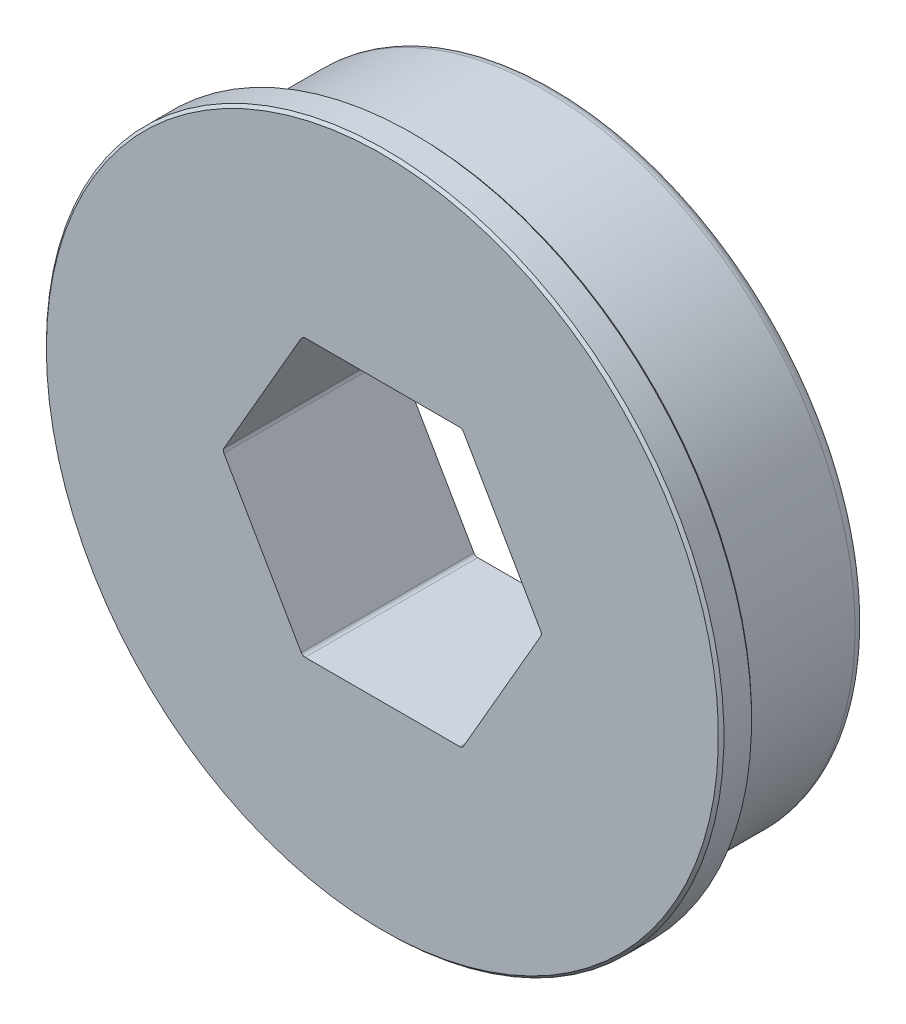
ISO-10303-21;
HEADER;
FILE_DESCRIPTION(('STEP AP214'),'2;1');
FILE_NAME('part.step','',(''),(''),'','','');
FILE_SCHEMA(('AUTOMOTIVE_DESIGN { 1 0 10303 214 1 1 1 1 }'));
ENDSEC;
DATA;
#1=APPLICATION_CONTEXT('core data for automotive mechanical design processes');
#2=APPLICATION_PROTOCOL_DEFINITION('international standard','automotive_design',2000,#1);
#3=PRODUCT_CONTEXT('',#1,'mechanical');
#4=PRODUCT('Part','Part','',(#3));
#5=PRODUCT_RELATED_PRODUCT_CATEGORY('part','',(#4));
#6=PRODUCT_DEFINITION_FORMATION('','',#4);
#7=PRODUCT_DEFINITION_CONTEXT('part definition',#1,'design');
#8=PRODUCT_DEFINITION('design','',#6,#7);
#9=PRODUCT_DEFINITION_SHAPE('','',#8);
#10=(LENGTH_UNIT() NAMED_UNIT(*) SI_UNIT(.MILLI.,.METRE.));
#11=(NAMED_UNIT(*) PLANE_ANGLE_UNIT() SI_UNIT($,.RADIAN.));
#12=(NAMED_UNIT(*) SI_UNIT($,.STERADIAN.) SOLID_ANGLE_UNIT());
#13=UNCERTAINTY_MEASURE_WITH_UNIT(LENGTH_MEASURE(1.E-05),#10,'distance_accuracy_value','');
#14=(GEOMETRIC_REPRESENTATION_CONTEXT(3) GLOBAL_UNCERTAINTY_ASSIGNED_CONTEXT((#13)) GLOBAL_UNIT_ASSIGNED_CONTEXT((#10,
#11,#12)) REPRESENTATION_CONTEXT('',''));
#15=CARTESIAN_POINT('',(0.,0.,0.));
#16=DIRECTION('',(0.,0.,1.));
#17=DIRECTION('',(1.,0.,0.));
#18=AXIS2_PLACEMENT_3D('',#15,#16,#17);
#19=CARTESIAN_POINT('',(0.,0.,7.80034));
#20=DIRECTION('',(0.,0.,-1.));
#21=DIRECTION('',(-1.,0.,0.));
#22=AXIS2_PLACEMENT_3D('',#19,#20,#21);
#23=CONICAL_SURFACE('',#22,15.5575,0.785398163397442);
#24=CARTESIAN_POINT('',(0.,0.,7.92734));
#25=DIRECTION('',(0.,0.,-1.));
#26=DIRECTION('',(-1.,0.,0.));
#27=AXIS2_PLACEMENT_3D('',#24,#25,#26);
#28=CIRCLE('',#27,15.4305);
#29=CARTESIAN_POINT('',(-15.4305,0.,7.92734));
#30=VERTEX_POINT('',#29);
#31=EDGE_CURVE('E181',#30,#30,#28,.T.);
#32=ORIENTED_EDGE('',*,*,#31,.T.);
#33=EDGE_LOOP('',(#32));
#34=FACE_BOUND('',#33,.T.);
#35=CARTESIAN_POINT('',(0.,0.,7.80034));
#36=DIRECTION('',(0.,0.,-1.));
#37=DIRECTION('',(-1.,0.,0.));
#38=AXIS2_PLACEMENT_3D('',#35,#36,#37);
#39=CIRCLE('',#38,15.5575);
#40=CARTESIAN_POINT('',(-15.5575,0.,7.80034));
#41=VERTEX_POINT('',#40);
#42=EDGE_CURVE('E168',#41,#41,#39,.T.);
#43=ORIENTED_EDGE('',*,*,#42,.F.);
#44=EDGE_LOOP('',(#43));
#45=FACE_BOUND('',#44,.T.);
#46=ADVANCED_FACE('F34',(#34,#45),#23,.T.);
#47=CARTESIAN_POINT('',(15.4305,0.,7.92734));
#48=DIRECTION('',(0.,0.,1.));
#49=DIRECTION('',(1.,0.,0.));
#50=AXIS2_PLACEMENT_3D('',#47,#48,#49);
#51=PLANE('',#50);
#52=DIRECTION('',(1.,0.,0.));
#53=VECTOR('',#52,1.);
#54=CARTESIAN_POINT('',(-3.66617420935412,-6.35,7.92734));
#55=LINE('',#54,#53);
#56=CARTESIAN_POINT('',(-3.54885663465478,-6.35,7.92734));
#57=VERTEX_POINT('',#56);
#58=CARTESIAN_POINT('',(3.5488566346548,-6.35000000000001,7.92734));
#59=VERTEX_POINT('',#58);
#60=EDGE_CURVE('E159',#57,#59,#55,.T.);
#61=ORIENTED_EDGE('',*,*,#60,.F.);
#62=CARTESIAN_POINT('',(-3.54885663465478,-6.1468,7.92734));
#63=DIRECTION('',(0.,0.,1.));
#64=DIRECTION('',(1.,0.,0.));
#65=AXIS2_PLACEMENT_3D('',#62,#63,#64);
#66=CIRCLE('',#65,0.2032);
#67=CARTESIAN_POINT('',(-3.72483299670378,-6.24840000000001,7.92734));
#68=VERTEX_POINT('',#67);
#69=EDGE_CURVE('E217',#57,#68,#66,.F.);
#70=ORIENTED_EDGE('',*,*,#69,.T.);
#71=DIRECTION('',(0.5,-0.866025403784439,0.));
#72=VECTOR('',#71,1.);
#73=CARTESIAN_POINT('',(-7.33234841870824,0.,7.92734));
#74=LINE('',#73,#72);
#75=CARTESIAN_POINT('',(-7.27368963135857,-0.101600000000002,7.92734));
#76=VERTEX_POINT('',#75);
#77=EDGE_CURVE('E164',#76,#68,#74,.T.);
#78=ORIENTED_EDGE('',*,*,#77,.F.);
#79=CARTESIAN_POINT('',(-7.09771326930958,0.,7.92734));
#80=DIRECTION('',(0.,0.,1.));
#81=DIRECTION('',(1.,0.,0.));
#82=AXIS2_PLACEMENT_3D('',#79,#80,#81);
#83=CIRCLE('',#82,0.2032);
#84=CARTESIAN_POINT('',(-7.27368963135857,0.101599999999999,7.92734));
#85=VERTEX_POINT('',#84);
#86=EDGE_CURVE('E225',#76,#85,#83,.F.);
#87=ORIENTED_EDGE('',*,*,#86,.T.);
#88=DIRECTION('',(-0.5,-0.866025403784439,0.));
#89=VECTOR('',#88,1.);
#90=CARTESIAN_POINT('',(-3.66617420935412,6.34999999999999,7.92734));
#91=LINE('',#90,#89);
#92=CARTESIAN_POINT('',(-3.72483299670379,6.24839999999999,7.92734));
#93=VERTEX_POINT('',#92);
#94=EDGE_CURVE('E157',#93,#85,#91,.T.);
#95=ORIENTED_EDGE('',*,*,#94,.F.);
#96=CARTESIAN_POINT('',(-3.54885663465479,6.14679999999999,7.92734));
#97=DIRECTION('',(0.,0.,1.));
#98=DIRECTION('',(1.,0.,0.));
#99=AXIS2_PLACEMENT_3D('',#96,#97,#98);
#100=CIRCLE('',#99,0.2032);
#101=CARTESIAN_POINT('',(-3.54885663465479,6.34999999999999,7.92734));
#102=VERTEX_POINT('',#101);
#103=EDGE_CURVE('E229',#93,#102,#100,.F.);
#104=ORIENTED_EDGE('',*,*,#103,.T.);
#105=DIRECTION('',(-1.,0.,0.));
#106=VECTOR('',#105,1.);
#107=CARTESIAN_POINT('',(3.66617420935413,6.35,7.92734));
#108=LINE('',#107,#106);
#109=CARTESIAN_POINT('',(3.5488566346548,6.35,7.92734));
#110=VERTEX_POINT('',#109);
#111=EDGE_CURVE('E153',#110,#102,#108,.T.);
#112=ORIENTED_EDGE('',*,*,#111,.F.);
#113=CARTESIAN_POINT('',(3.5488566346548,6.14679999999999,7.92734));
#114=DIRECTION('',(0.,0.,1.));
#115=DIRECTION('',(1.,0.,0.));
#116=AXIS2_PLACEMENT_3D('',#113,#114,#115);
#117=CIRCLE('',#116,0.2032);
#118=CARTESIAN_POINT('',(3.7248329967038,6.24839999999999,7.92734));
#119=VERTEX_POINT('',#118);
#120=EDGE_CURVE('E152',#110,#119,#117,.F.);
#121=ORIENTED_EDGE('',*,*,#120,.T.);
#122=DIRECTION('',(-0.5,0.866025403784438,0.));
#123=VECTOR('',#122,1.);
#124=CARTESIAN_POINT('',(7.33234841870826,0.,7.92734));
#125=LINE('',#124,#123);
#126=CARTESIAN_POINT('',(7.27368963135859,0.101599999999995,7.92734));
#127=VERTEX_POINT('',#126);
#128=EDGE_CURVE('E141',#127,#119,#125,.T.);
#129=ORIENTED_EDGE('',*,*,#128,.F.);
#130=CARTESIAN_POINT('',(7.09771326930959,0.,7.92734));
#131=DIRECTION('',(0.,0.,1.));
#132=DIRECTION('',(1.,0.,0.));
#133=AXIS2_PLACEMENT_3D('',#130,#131,#132);
#134=CIRCLE('',#133,0.2032);
#135=CARTESIAN_POINT('',(7.27368963135859,-0.101600000000005,7.92734));
#136=VERTEX_POINT('',#135);
#137=EDGE_CURVE('E125',#127,#136,#134,.F.);
#138=ORIENTED_EDGE('',*,*,#137,.T.);
#139=DIRECTION('',(0.5,0.866025403784439,0.));
#140=VECTOR('',#139,1.);
#141=CARTESIAN_POINT('',(3.66617420935413,-6.35000000000001,7.92734));
#142=LINE('',#141,#140);
#143=CARTESIAN_POINT('',(3.7248329967038,-6.24840000000001,7.92734));
#144=VERTEX_POINT('',#143);
#145=EDGE_CURVE('E154',#144,#136,#142,.T.);
#146=ORIENTED_EDGE('',*,*,#145,.F.);
#147=CARTESIAN_POINT('',(3.5488566346548,-6.14680000000001,7.92734));
#148=DIRECTION('',(0.,0.,1.));
#149=DIRECTION('',(1.,0.,0.));
#150=AXIS2_PLACEMENT_3D('',#147,#148,#149);
#151=CIRCLE('',#150,0.2032);
#152=EDGE_CURVE('E221',#144,#59,#151,.F.);
#153=ORIENTED_EDGE('',*,*,#152,.T.);
#154=EDGE_LOOP('',(#61,#70,#78,#87,#95,#104,#112,#121,#129,#138,#146,#153));
#155=FACE_BOUND('',#154,.T.);
#156=ORIENTED_EDGE('',*,*,#31,.F.);
#157=EDGE_LOOP('',(#156));
#158=FACE_BOUND('',#157,.T.);
#159=ADVANCED_FACE('F149',(#155,#158),#51,.T.);
#160=CARTESIAN_POINT('',(0.,0.,0.));
#161=DIRECTION('',(0.,0.,-1.));
#162=DIRECTION('',(-1.,0.,0.));
#163=AXIS2_PLACEMENT_3D('',#160,#161,#162);
#164=PLANE('',#163);
#165=CARTESIAN_POINT('',(0.,0.,0.));
#166=DIRECTION('',(0.,0.,-1.));
#167=DIRECTION('',(-1.,0.,0.));
#168=AXIS2_PLACEMENT_3D('',#165,#166,#167);
#169=CIRCLE('',#168,13.7795);
#170=CARTESIAN_POINT('',(-13.7795,0.,0.));
#171=VERTEX_POINT('',#170);
#172=EDGE_CURVE('E42',#171,#171,#169,.T.);
#173=ORIENTED_EDGE('',*,*,#172,.T.);
#174=EDGE_LOOP('',(#173));
#175=FACE_BOUND('',#174,.T.);
#176=DIRECTION('',(0.5,-0.866025403784439,0.));
#177=VECTOR('',#176,1.);
#178=CARTESIAN_POINT('',(-7.33234841870824,0.,0.));
#179=LINE('',#178,#177);
#180=CARTESIAN_POINT('',(-7.27368963135857,-0.101600000000002,0.));
#181=VERTEX_POINT('',#180);
#182=CARTESIAN_POINT('',(-3.72483299670378,-6.24840000000001,0.));
#183=VERTEX_POINT('',#182);
#184=EDGE_CURVE('E172',#181,#183,#179,.T.);
#185=ORIENTED_EDGE('',*,*,#184,.T.);
#186=CARTESIAN_POINT('',(-3.54885663465478,-6.1468,0.));
#187=DIRECTION('',(0.,0.,-1.));
#188=DIRECTION('',(-1.,0.,0.));
#189=AXIS2_PLACEMENT_3D('',#186,#187,#188);
#190=CIRCLE('',#189,0.2032);
#191=CARTESIAN_POINT('',(-3.54885663465478,-6.35,0.));
#192=VERTEX_POINT('',#191);
#193=EDGE_CURVE('E219',#183,#192,#190,.F.);
#194=ORIENTED_EDGE('',*,*,#193,.T.);
#195=DIRECTION('',(1.,0.,0.));
#196=VECTOR('',#195,1.);
#197=CARTESIAN_POINT('',(-3.66617420935412,-6.35,0.));
#198=LINE('',#197,#196);
#199=CARTESIAN_POINT('',(3.5488566346548,-6.35000000000001,0.));
#200=VERTEX_POINT('',#199);
#201=EDGE_CURVE('E167',#192,#200,#198,.T.);
#202=ORIENTED_EDGE('',*,*,#201,.T.);
#203=CARTESIAN_POINT('',(3.5488566346548,-6.14680000000001,0.));
#204=DIRECTION('',(0.,0.,-1.));
#205=DIRECTION('',(-1.,0.,0.));
#206=AXIS2_PLACEMENT_3D('',#203,#204,#205);
#207=CIRCLE('',#206,0.2032);
#208=CARTESIAN_POINT('',(3.7248329967038,-6.24840000000001,0.));
#209=VERTEX_POINT('',#208);
#210=EDGE_CURVE('E223',#200,#209,#207,.F.);
#211=ORIENTED_EDGE('',*,*,#210,.T.);
#212=DIRECTION('',(0.5,0.866025403784439,0.));
#213=VECTOR('',#212,1.);
#214=CARTESIAN_POINT('',(3.66617420935413,-6.35000000000001,0.));
#215=LINE('',#214,#213);
#216=CARTESIAN_POINT('',(7.27368963135859,-0.101600000000005,0.));
#217=VERTEX_POINT('',#216);
#218=EDGE_CURVE('E303',#209,#217,#215,.T.);
#219=ORIENTED_EDGE('',*,*,#218,.T.);
#220=CARTESIAN_POINT('',(7.09771326930959,0.,0.));
#221=DIRECTION('',(0.,0.,-1.));
#222=DIRECTION('',(-1.,0.,0.));
#223=AXIS2_PLACEMENT_3D('',#220,#221,#222);
#224=CIRCLE('',#223,0.2032);
#225=CARTESIAN_POINT('',(7.27368963135859,0.101599999999995,0.));
#226=VERTEX_POINT('',#225);
#227=EDGE_CURVE('E135',#217,#226,#224,.F.);
#228=ORIENTED_EDGE('',*,*,#227,.T.);
#229=DIRECTION('',(-0.5,0.866025403784438,0.));
#230=VECTOR('',#229,1.);
#231=CARTESIAN_POINT('',(7.33234841870826,0.,0.));
#232=LINE('',#231,#230);
#233=CARTESIAN_POINT('',(3.7248329967038,6.24839999999999,0.));
#234=VERTEX_POINT('',#233);
#235=EDGE_CURVE('E144',#226,#234,#232,.T.);
#236=ORIENTED_EDGE('',*,*,#235,.T.);
#237=CARTESIAN_POINT('',(3.5488566346548,6.14679999999999,0.));
#238=DIRECTION('',(0.,0.,-1.));
#239=DIRECTION('',(-1.,0.,0.));
#240=AXIS2_PLACEMENT_3D('',#237,#238,#239);
#241=CIRCLE('',#240,0.2032);
#242=CARTESIAN_POINT('',(3.5488566346548,6.35,0.));
#243=VERTEX_POINT('',#242);
#244=EDGE_CURVE('E215',#234,#243,#241,.F.);
#245=ORIENTED_EDGE('',*,*,#244,.T.);
#246=DIRECTION('',(-1.,0.,0.));
#247=VECTOR('',#246,1.);
#248=CARTESIAN_POINT('',(3.66617420935413,6.35,0.));
#249=LINE('',#248,#247);
#250=CARTESIAN_POINT('',(-3.54885663465479,6.34999999999999,0.));
#251=VERTEX_POINT('',#250);
#252=EDGE_CURVE('E289',#243,#251,#249,.T.);
#253=ORIENTED_EDGE('',*,*,#252,.T.);
#254=CARTESIAN_POINT('',(-3.54885663465479,6.14679999999999,0.));
#255=DIRECTION('',(0.,0.,-1.));
#256=DIRECTION('',(-1.,0.,0.));
#257=AXIS2_PLACEMENT_3D('',#254,#255,#256);
#258=CIRCLE('',#257,0.2032);
#259=CARTESIAN_POINT('',(-3.72483299670379,6.24839999999999,0.));
#260=VERTEX_POINT('',#259);
#261=EDGE_CURVE('E56',#251,#260,#258,.F.);
#262=ORIENTED_EDGE('',*,*,#261,.T.);
#263=DIRECTION('',(-0.5,-0.866025403784439,0.));
#264=VECTOR('',#263,1.);
#265=CARTESIAN_POINT('',(-3.66617420935412,6.34999999999999,0.));
#266=LINE('',#265,#264);
#267=CARTESIAN_POINT('',(-7.27368963135857,0.101599999999999,0.));
#268=VERTEX_POINT('',#267);
#269=EDGE_CURVE('E283',#260,#268,#266,.T.);
#270=ORIENTED_EDGE('',*,*,#269,.T.);
#271=CARTESIAN_POINT('',(-7.09771326930958,0.,0.));
#272=DIRECTION('',(0.,0.,-1.));
#273=DIRECTION('',(-1.,0.,0.));
#274=AXIS2_PLACEMENT_3D('',#271,#272,#273);
#275=CIRCLE('',#274,0.2032);
#276=EDGE_CURVE('E227',#268,#181,#275,.F.);
#277=ORIENTED_EDGE('',*,*,#276,.T.);
#278=EDGE_LOOP('',(#185,#194,#202,#211,#219,#228,#236,#245,#253,#262,#270,#277));
#279=FACE_BOUND('',#278,.T.);
#280=ADVANCED_FACE('F234',(#175,#279),#164,.T.);
#281=CARTESIAN_POINT('',(0.,0.,7.92734));
#282=DIRECTION('',(0.,0.,-1.));
#283=DIRECTION('',(-1.,0.,0.));
#284=AXIS2_PLACEMENT_3D('',#281,#282,#283);
#285=CYLINDRICAL_SURFACE('',#284,14.2875);
#286=CARTESIAN_POINT('',(0.,0.,0.508));
#287=DIRECTION('',(0.,0.,-1.));
#288=DIRECTION('',(-1.,0.,0.));
#289=AXIS2_PLACEMENT_3D('',#286,#287,#288);
#290=CIRCLE('',#289,14.2875);
#291=CARTESIAN_POINT('',(-14.2875,0.,0.508));
#292=VERTEX_POINT('',#291);
#293=EDGE_CURVE('E11',#292,#292,#290,.F.);
#294=ORIENTED_EDGE('',*,*,#293,.T.);
#295=EDGE_LOOP('',(#294));
#296=FACE_BOUND('',#295,.T.);
#297=CARTESIAN_POINT('',(0.,0.,5.89534));
#298=DIRECTION('',(0.,0.,-1.));
#299=DIRECTION('',(-1.,0.,0.));
#300=AXIS2_PLACEMENT_3D('',#297,#298,#299);
#301=CIRCLE('',#300,14.2875);
#302=CARTESIAN_POINT('',(-14.2875,0.,5.89534));
#303=VERTEX_POINT('',#302);
#304=EDGE_CURVE('E178',#303,#303,#301,.T.);
#305=ORIENTED_EDGE('',*,*,#304,.T.);
#306=EDGE_LOOP('',(#305));
#307=FACE_BOUND('',#306,.T.);
#308=ADVANCED_FACE('F346',(#296,#307),#285,.T.);
#309=CARTESIAN_POINT('',(14.2875,0.,5.89534));
#310=DIRECTION('',(0.,0.,1.));
#311=DIRECTION('',(1.,0.,0.));
#312=AXIS2_PLACEMENT_3D('',#309,#310,#311);
#313=PLANE('',#312);
#314=CARTESIAN_POINT('',(0.,0.,5.89534));
#315=DIRECTION('',(0.,0.,-1.));
#316=DIRECTION('',(-1.,0.,0.));
#317=AXIS2_PLACEMENT_3D('',#314,#315,#316);
#318=CIRCLE('',#317,13.97);
#319=CARTESIAN_POINT('',(-13.97,0.,5.89534));
#320=VERTEX_POINT('',#319);
#321=EDGE_CURVE('E175',#320,#320,#318,.T.);
#322=ORIENTED_EDGE('',*,*,#321,.T.);
#323=EDGE_LOOP('',(#322));
#324=FACE_BOUND('',#323,.T.);
#325=ORIENTED_EDGE('',*,*,#304,.F.);
#326=EDGE_LOOP('',(#325));
#327=FACE_BOUND('',#326,.T.);
#328=ADVANCED_FACE('F342',(#324,#327),#313,.T.);
#329=CARTESIAN_POINT('',(0.,0.,7.92734));
#330=DIRECTION('',(0.,0.,-1.));
#331=DIRECTION('',(-1.,0.,0.));
#332=AXIS2_PLACEMENT_3D('',#329,#330,#331);
#333=CYLINDRICAL_SURFACE('',#332,13.97);
#334=CARTESIAN_POINT('',(0.,0.,6.40333999999999));
#335=DIRECTION('',(0.,0.,-1.));
#336=DIRECTION('',(-1.,0.,0.));
#337=AXIS2_PLACEMENT_3D('',#334,#335,#336);
#338=CIRCLE('',#337,13.97);
#339=CARTESIAN_POINT('',(-13.97,0.,6.40333999999999));
#340=VERTEX_POINT('',#339);
#341=EDGE_CURVE('E171',#340,#340,#338,.T.);
#342=ORIENTED_EDGE('',*,*,#341,.T.);
#343=EDGE_LOOP('',(#342));
#344=FACE_BOUND('',#343,.T.);
#345=ORIENTED_EDGE('',*,*,#321,.F.);
#346=EDGE_LOOP('',(#345));
#347=FACE_BOUND('',#346,.T.);
#348=ADVANCED_FACE('F338',(#344,#347),#333,.T.);
#349=CARTESIAN_POINT('',(13.97,0.,6.40334));
#350=DIRECTION('',(0.,0.,-1.));
#351=DIRECTION('',(-1.,0.,0.));
#352=AXIS2_PLACEMENT_3D('',#349,#350,#351);
#353=PLANE('',#352);
#354=CARTESIAN_POINT('',(0.,0.,6.40334));
#355=DIRECTION('',(0.,0.,-1.));
#356=DIRECTION('',(-1.,0.,0.));
#357=AXIS2_PLACEMENT_3D('',#354,#355,#356);
#358=CIRCLE('',#357,15.4304999999999);
#359=CARTESIAN_POINT('',(-15.4304999999999,0.,6.40334));
#360=VERTEX_POINT('',#359);
#361=EDGE_CURVE('E184',#360,#360,#358,.T.);
#362=ORIENTED_EDGE('',*,*,#361,.T.);
#363=EDGE_LOOP('',(#362));
#364=FACE_BOUND('',#363,.T.);
#365=ORIENTED_EDGE('',*,*,#341,.F.);
#366=EDGE_LOOP('',(#365));
#367=FACE_BOUND('',#366,.T.);
#368=ADVANCED_FACE('F334',(#364,#367),#353,.T.);
#369=CARTESIAN_POINT('',(0.,0.,7.92734));
#370=DIRECTION('',(0.,0.,-1.));
#371=DIRECTION('',(-1.,0.,0.));
#372=AXIS2_PLACEMENT_3D('',#369,#370,#371);
#373=CYLINDRICAL_SURFACE('',#372,15.5575);
#374=CARTESIAN_POINT('',(0.,0.,6.53034000000008));
#375=DIRECTION('',(0.,0.,-1.));
#376=DIRECTION('',(-1.,0.,0.));
#377=AXIS2_PLACEMENT_3D('',#374,#375,#376);
#378=CIRCLE('',#377,15.5575);
#379=CARTESIAN_POINT('',(-15.5575,0.,6.53034000000008));
#380=VERTEX_POINT('',#379);
#381=EDGE_CURVE('E187',#380,#380,#378,.F.);
#382=ORIENTED_EDGE('',*,*,#381,.T.);
#383=EDGE_LOOP('',(#382));
#384=FACE_BOUND('',#383,.T.);
#385=ORIENTED_EDGE('',*,*,#42,.T.);
#386=EDGE_LOOP('',(#385));
#387=FACE_BOUND('',#386,.T.);
#388=ADVANCED_FACE('F331',(#384,#387),#373,.T.);
#389=CARTESIAN_POINT('',(-3.66617420935412,-6.35,0.));
#390=DIRECTION('',(0.,-1.,0.));
#391=DIRECTION('',(1.,0.,0.));
#392=AXIS2_PLACEMENT_3D('',#389,#390,#391);
#393=PLANE('',#392);
#394=ORIENTED_EDGE('',*,*,#201,.F.);
#395=DIRECTION('',(0.,0.,1.));
#396=VECTOR('',#395,1.);
#397=CARTESIAN_POINT('',(-3.54885663465478,-6.35,7.92734));
#398=LINE('',#397,#396);
#399=EDGE_CURVE('E201',#192,#57,#398,.T.);
#400=ORIENTED_EDGE('',*,*,#399,.T.);
#401=ORIENTED_EDGE('',*,*,#60,.T.);
#402=DIRECTION('',(0.,0.,1.));
#403=VECTOR('',#402,1.);
#404=CARTESIAN_POINT('',(3.5488566346548,-6.35000000000001,0.));
#405=LINE('',#404,#403);
#406=EDGE_CURVE('E199',#59,#200,#405,.F.);
#407=ORIENTED_EDGE('',*,*,#406,.T.);
#408=EDGE_LOOP('',(#394,#400,#401,#407));
#409=FACE_BOUND('',#408,.T.);
#410=ADVANCED_FACE('F296',(#409),#393,.F.);
#411=CARTESIAN_POINT('',(-7.33234841870824,0.,0.));
#412=DIRECTION('',(-0.866025403784439,-0.5,0.));
#413=DIRECTION('',(0.5,-0.866025403784439,0.));
#414=AXIS2_PLACEMENT_3D('',#411,#412,#413);
#415=PLANE('',#414);
#416=ORIENTED_EDGE('',*,*,#77,.T.);
#417=DIRECTION('',(0.,0.,1.));
#418=VECTOR('',#417,1.);
#419=CARTESIAN_POINT('',(-3.72483299670378,-6.2484,0.));
#420=LINE('',#419,#418);
#421=EDGE_CURVE('E207',#68,#183,#420,.F.);
#422=ORIENTED_EDGE('',*,*,#421,.T.);
#423=ORIENTED_EDGE('',*,*,#184,.F.);
#424=DIRECTION('',(0.,0.,1.));
#425=VECTOR('',#424,1.);
#426=CARTESIAN_POINT('',(-7.27368963135857,-0.101600000000002,7.92734));
#427=LINE('',#426,#425);
#428=EDGE_CURVE('E204',#181,#76,#427,.T.);
#429=ORIENTED_EDGE('',*,*,#428,.T.);
#430=EDGE_LOOP('',(#416,#422,#423,#429));
#431=FACE_BOUND('',#430,.T.);
#432=ADVANCED_FACE('F285',(#431),#415,.F.);
#433=CARTESIAN_POINT('',(-3.66617420935412,6.34999999999999,0.));
#434=DIRECTION('',(-0.866025403784439,0.5,0.));
#435=DIRECTION('',(-0.5,-0.866025403784439,0.));
#436=AXIS2_PLACEMENT_3D('',#433,#434,#435);
#437=PLANE('',#436);
#438=ORIENTED_EDGE('',*,*,#94,.T.);
#439=DIRECTION('',(0.,0.,1.));
#440=VECTOR('',#439,1.);
#441=CARTESIAN_POINT('',(-7.27368963135857,0.101599999999998,0.));
#442=LINE('',#441,#440);
#443=EDGE_CURVE('E49',#85,#268,#442,.F.);
#444=ORIENTED_EDGE('',*,*,#443,.T.);
#445=ORIENTED_EDGE('',*,*,#269,.F.);
#446=DIRECTION('',(0.,0.,1.));
#447=VECTOR('',#446,1.);
#448=CARTESIAN_POINT('',(-3.72483299670379,6.24839999999999,7.92734));
#449=LINE('',#448,#447);
#450=EDGE_CURVE('E209',#260,#93,#449,.T.);
#451=ORIENTED_EDGE('',*,*,#450,.T.);
#452=EDGE_LOOP('',(#438,#444,#445,#451));
#453=FACE_BOUND('',#452,.T.);
#454=ADVANCED_FACE('F315',(#453),#437,.F.);
#455=CARTESIAN_POINT('',(3.66617420935413,6.35,0.));
#456=DIRECTION('',(0.,1.,0.));
#457=DIRECTION('',(-1.,0.,0.));
#458=AXIS2_PLACEMENT_3D('',#455,#456,#457);
#459=PLANE('',#458);
#460=ORIENTED_EDGE('',*,*,#252,.F.);
#461=DIRECTION('',(0.,0.,1.));
#462=VECTOR('',#461,1.);
#463=CARTESIAN_POINT('',(3.5488566346548,6.35,7.92734));
#464=LINE('',#463,#462);
#465=EDGE_CURVE('E196',#243,#110,#464,.T.);
#466=ORIENTED_EDGE('',*,*,#465,.T.);
#467=ORIENTED_EDGE('',*,*,#111,.T.);
#468=DIRECTION('',(0.,0.,1.));
#469=VECTOR('',#468,1.);
#470=CARTESIAN_POINT('',(-3.54885663465479,6.34999999999999,0.));
#471=LINE('',#470,#469);
#472=EDGE_CURVE('E194',#102,#251,#471,.F.);
#473=ORIENTED_EDGE('',*,*,#472,.T.);
#474=EDGE_LOOP('',(#460,#466,#467,#473));
#475=FACE_BOUND('',#474,.T.);
#476=ADVANCED_FACE('F316',(#475),#459,.F.);
#477=CARTESIAN_POINT('',(7.33234841870826,0.,0.));
#478=DIRECTION('',(0.866025403784438,0.5,0.));
#479=DIRECTION('',(-0.5,0.866025403784439,0.));
#480=AXIS2_PLACEMENT_3D('',#477,#478,#479);
#481=PLANE('',#480);
#482=ORIENTED_EDGE('',*,*,#235,.F.);
#483=DIRECTION('',(0.,0.,1.));
#484=VECTOR('',#483,1.);
#485=CARTESIAN_POINT('',(7.27368963135859,0.101599999999995,7.92734));
#486=LINE('',#485,#484);
#487=EDGE_CURVE('E129',#226,#127,#486,.T.);
#488=ORIENTED_EDGE('',*,*,#487,.T.);
#489=ORIENTED_EDGE('',*,*,#128,.T.);
#490=DIRECTION('',(0.,0.,1.));
#491=VECTOR('',#490,1.);
#492=CARTESIAN_POINT('',(3.7248329967038,6.24839999999999,0.));
#493=LINE('',#492,#491);
#494=EDGE_CURVE('E146',#119,#234,#493,.F.);
#495=ORIENTED_EDGE('',*,*,#494,.T.);
#496=EDGE_LOOP('',(#482,#488,#489,#495));
#497=FACE_BOUND('',#496,.T.);
#498=ADVANCED_FACE('F140',(#497),#481,.F.);
#499=CARTESIAN_POINT('',(3.66617420935413,-6.35000000000001,0.));
#500=DIRECTION('',(0.866025403784439,-0.5,0.));
#501=DIRECTION('',(0.5,0.866025403784439,0.));
#502=AXIS2_PLACEMENT_3D('',#499,#500,#501);
#503=PLANE('',#502);
#504=ORIENTED_EDGE('',*,*,#145,.T.);
#505=DIRECTION('',(0.,0.,1.));
#506=VECTOR('',#505,1.);
#507=CARTESIAN_POINT('',(7.27368963135859,-0.101600000000005,0.));
#508=LINE('',#507,#506);
#509=EDGE_CURVE('E130',#136,#217,#508,.F.);
#510=ORIENTED_EDGE('',*,*,#509,.T.);
#511=ORIENTED_EDGE('',*,*,#218,.F.);
#512=DIRECTION('',(0.,0.,1.));
#513=VECTOR('',#512,1.);
#514=CARTESIAN_POINT('',(3.7248329967038,-6.24840000000001,7.92734));
#515=LINE('',#514,#513);
#516=EDGE_CURVE('E145',#209,#144,#515,.T.);
#517=ORIENTED_EDGE('',*,*,#516,.T.);
#518=EDGE_LOOP('',(#504,#510,#511,#517));
#519=FACE_BOUND('',#518,.T.);
#520=ADVANCED_FACE('F258',(#519),#503,.F.);
#521=CARTESIAN_POINT('',(0.,0.,6.40334));
#522=DIRECTION('',(0.,0.,1.));
#523=DIRECTION('',(1.,0.,0.));
#524=AXIS2_PLACEMENT_3D('',#521,#522,#523);
#525=CONICAL_SURFACE('',#524,15.4304999999999,0.785398163397421);
#526=ORIENTED_EDGE('',*,*,#381,.F.);
#527=EDGE_LOOP('',(#526));
#528=FACE_BOUND('',#527,.T.);
#529=ORIENTED_EDGE('',*,*,#361,.F.);
#530=EDGE_LOOP('',(#529));
#531=FACE_BOUND('',#530,.T.);
#532=ADVANCED_FACE('F255',(#528,#531),#525,.T.);
#533=CARTESIAN_POINT('',(7.09771326930959,0.,0.));
#534=DIRECTION('',(0.,0.,-1.));
#535=DIRECTION('',(-1.,0.,0.));
#536=AXIS2_PLACEMENT_3D('',#533,#534,#535);
#537=CYLINDRICAL_SURFACE('',#536,0.2032);
#538=ORIENTED_EDGE('',*,*,#227,.F.);
#539=ORIENTED_EDGE('',*,*,#509,.F.);
#540=ORIENTED_EDGE('',*,*,#137,.F.);
#541=ORIENTED_EDGE('',*,*,#487,.F.);
#542=EDGE_LOOP('',(#538,#539,#540,#541));
#543=FACE_BOUND('',#542,.T.);
#544=ADVANCED_FACE('F128',(#543),#537,.F.);
#545=CARTESIAN_POINT('',(3.5488566346548,6.14679999999999,0.));
#546=DIRECTION('',(0.,0.,-1.));
#547=DIRECTION('',(-1.,0.,0.));
#548=AXIS2_PLACEMENT_3D('',#545,#546,#547);
#549=CYLINDRICAL_SURFACE('',#548,0.2032);
#550=ORIENTED_EDGE('',*,*,#244,.F.);
#551=ORIENTED_EDGE('',*,*,#494,.F.);
#552=ORIENTED_EDGE('',*,*,#120,.F.);
#553=ORIENTED_EDGE('',*,*,#465,.F.);
#554=EDGE_LOOP('',(#550,#551,#552,#553));
#555=FACE_BOUND('',#554,.T.);
#556=ADVANCED_FACE('F262',(#555),#549,.F.);
#557=CARTESIAN_POINT('',(-3.54885663465478,-6.1468,0.));
#558=DIRECTION('',(0.,0.,-1.));
#559=DIRECTION('',(-1.,0.,0.));
#560=AXIS2_PLACEMENT_3D('',#557,#558,#559);
#561=CYLINDRICAL_SURFACE('',#560,0.2032);
#562=ORIENTED_EDGE('',*,*,#193,.F.);
#563=ORIENTED_EDGE('',*,*,#421,.F.);
#564=ORIENTED_EDGE('',*,*,#69,.F.);
#565=ORIENTED_EDGE('',*,*,#399,.F.);
#566=EDGE_LOOP('',(#562,#563,#564,#565));
#567=FACE_BOUND('',#566,.T.);
#568=ADVANCED_FACE('F265',(#567),#561,.F.);
#569=CARTESIAN_POINT('',(3.5488566346548,-6.14680000000001,0.));
#570=DIRECTION('',(0.,0.,-1.));
#571=DIRECTION('',(-1.,0.,0.));
#572=AXIS2_PLACEMENT_3D('',#569,#570,#571);
#573=CYLINDRICAL_SURFACE('',#572,0.2032);
#574=ORIENTED_EDGE('',*,*,#210,.F.);
#575=ORIENTED_EDGE('',*,*,#406,.F.);
#576=ORIENTED_EDGE('',*,*,#152,.F.);
#577=ORIENTED_EDGE('',*,*,#516,.F.);
#578=EDGE_LOOP('',(#574,#575,#576,#577));
#579=FACE_BOUND('',#578,.T.);
#580=ADVANCED_FACE('F269',(#579),#573,.F.);
#581=CARTESIAN_POINT('',(-7.09771326930958,0.,0.));
#582=DIRECTION('',(0.,0.,-1.));
#583=DIRECTION('',(-1.,0.,0.));
#584=AXIS2_PLACEMENT_3D('',#581,#582,#583);
#585=CYLINDRICAL_SURFACE('',#584,0.2032);
#586=ORIENTED_EDGE('',*,*,#276,.F.);
#587=ORIENTED_EDGE('',*,*,#443,.F.);
#588=ORIENTED_EDGE('',*,*,#86,.F.);
#589=ORIENTED_EDGE('',*,*,#428,.F.);
#590=EDGE_LOOP('',(#586,#587,#588,#589));
#591=FACE_BOUND('',#590,.T.);
#592=ADVANCED_FACE('F242',(#591),#585,.F.);
#593=CARTESIAN_POINT('',(-3.54885663465479,6.14679999999999,0.));
#594=DIRECTION('',(0.,0.,-1.));
#595=DIRECTION('',(-1.,0.,0.));
#596=AXIS2_PLACEMENT_3D('',#593,#594,#595);
#597=CYLINDRICAL_SURFACE('',#596,0.2032);
#598=ORIENTED_EDGE('',*,*,#261,.F.);
#599=ORIENTED_EDGE('',*,*,#472,.F.);
#600=ORIENTED_EDGE('',*,*,#103,.F.);
#601=ORIENTED_EDGE('',*,*,#450,.F.);
#602=EDGE_LOOP('',(#598,#599,#600,#601));
#603=FACE_BOUND('',#602,.T.);
#604=ADVANCED_FACE('F237',(#603),#597,.F.);
#605=CARTESIAN_POINT('',(0.,0.,0.508));
#606=DIRECTION('',(0.,0.,-1.));
#607=DIRECTION('',(-1.,0.,0.));
#608=AXIS2_PLACEMENT_3D('',#605,#606,#607);
#609=TOROIDAL_SURFACE('',#608,13.7795,0.508);
#610=ORIENTED_EDGE('',*,*,#293,.F.);
#611=EDGE_LOOP('',(#610));
#612=FACE_BOUND('',#611,.T.);
#613=ORIENTED_EDGE('',*,*,#172,.F.);
#614=EDGE_LOOP('',(#613));
#615=FACE_BOUND('',#614,.T.);
#616=ADVANCED_FACE('F36',(#612,#615),#609,.T.);
#617=CLOSED_SHELL('',(#46,#159,#280,#308,#328,#348,#368,#388,#410,#432,#454,#476,#498,#520,#532,
#544,#556,#568,#580,#592,#604,#616));
#618=MANIFOLD_SOLID_BREP('B2',#617);
#619=ADVANCED_BREP_SHAPE_REPRESENTATION('',(#18,#618),#14);
#620=SHAPE_DEFINITION_REPRESENTATION(#9,#619);
ENDSEC;
END-ISO-10303-21;
